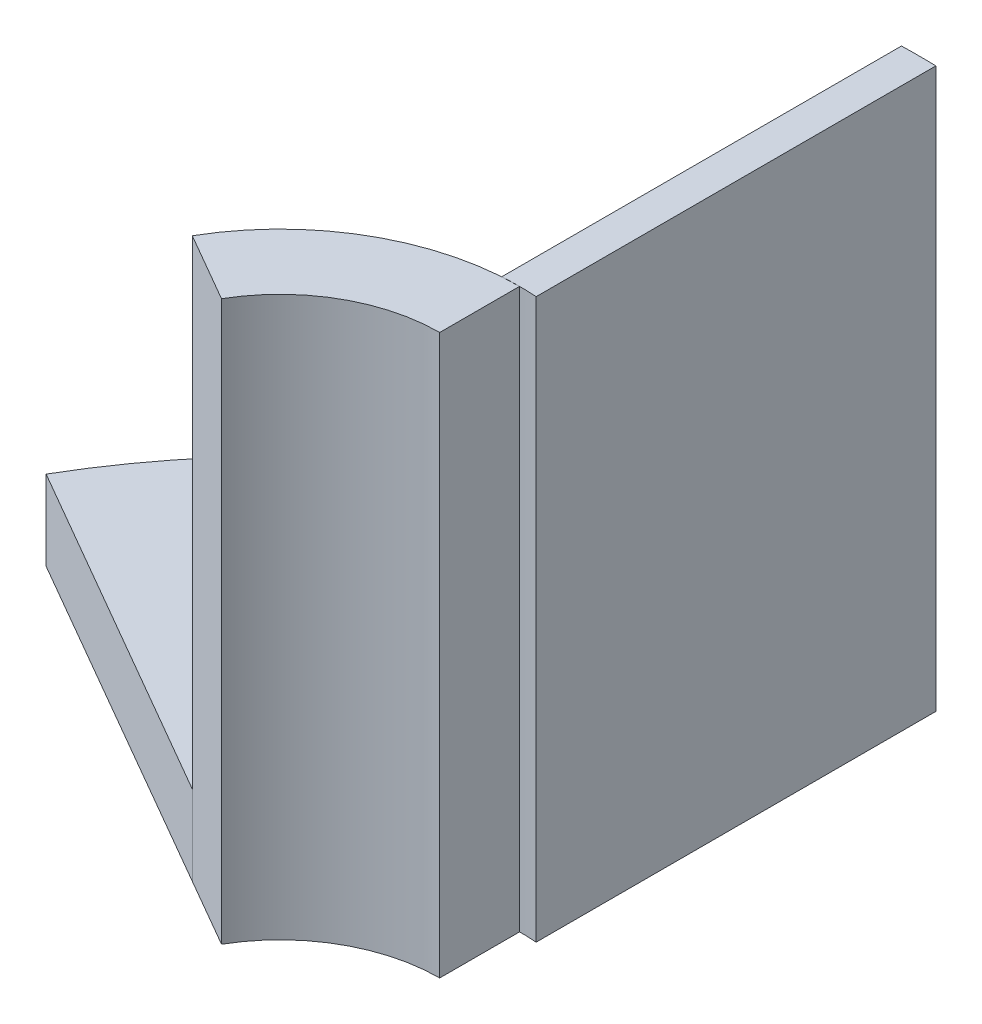
ISO-10303-21;
HEADER;
FILE_DESCRIPTION(('STEP AP214'),'2;1');
FILE_NAME('part.step','',(''),(''),'','','');
FILE_SCHEMA(('AUTOMOTIVE_DESIGN { 1 0 10303 214 1 1 1 1 }'));
ENDSEC;
DATA;
#1=APPLICATION_CONTEXT('core data for automotive mechanical design processes');
#2=APPLICATION_PROTOCOL_DEFINITION('international standard','automotive_design',2000,#1);
#3=PRODUCT_CONTEXT('',#1,'mechanical');
#4=PRODUCT('Part','Part','',(#3));
#5=PRODUCT_RELATED_PRODUCT_CATEGORY('part','',(#4));
#6=PRODUCT_DEFINITION_FORMATION('','',#4);
#7=PRODUCT_DEFINITION_CONTEXT('part definition',#1,'design');
#8=PRODUCT_DEFINITION('design','',#6,#7);
#9=PRODUCT_DEFINITION_SHAPE('','',#8);
#10=(LENGTH_UNIT() NAMED_UNIT(*) SI_UNIT(.MILLI.,.METRE.));
#11=(NAMED_UNIT(*) PLANE_ANGLE_UNIT() SI_UNIT($,.RADIAN.));
#12=(NAMED_UNIT(*) SI_UNIT($,.STERADIAN.) SOLID_ANGLE_UNIT());
#13=UNCERTAINTY_MEASURE_WITH_UNIT(LENGTH_MEASURE(1.E-05),#10,'distance_accuracy_value','');
#14=(GEOMETRIC_REPRESENTATION_CONTEXT(3) GLOBAL_UNCERTAINTY_ASSIGNED_CONTEXT((#13)) GLOBAL_UNIT_ASSIGNED_CONTEXT((#10,
#11,#12)) REPRESENTATION_CONTEXT('',''));
#15=CARTESIAN_POINT('',(0.,0.,0.));
#16=DIRECTION('',(0.,0.,1.));
#17=DIRECTION('',(1.,0.,0.));
#18=AXIS2_PLACEMENT_3D('',#15,#16,#17);
#19=CARTESIAN_POINT('',(0.,35.,0.));
#20=DIRECTION('',(0.,1.,0.));
#21=DIRECTION('',(0.,0.,1.));
#22=AXIS2_PLACEMENT_3D('',#19,#20,#21);
#23=PLANE('',#22);
#24=DIRECTION('',(0.,0.,1.));
#25=VECTOR('',#24,1.);
#26=CARTESIAN_POINT('',(1.07783990665666,35.,291558.));
#27=LINE('',#26,#25);
#28=CARTESIAN_POINT('',(1.07783990658591,35.,-39.9854756272475));
#29=VERTEX_POINT('',#28);
#30=CARTESIAN_POINT('',(1.07783990658592,35.,-14.9612252551492));
#31=VERTEX_POINT('',#30);
#32=EDGE_CURVE('E98',#29,#31,#27,.T.);
#33=ORIENTED_EDGE('',*,*,#32,.F.);
#34=CARTESIAN_POINT('',(0.,35.,0.));
#35=DIRECTION('',(0.,1.,0.));
#36=DIRECTION('',(0.,0.,1.));
#37=AXIS2_PLACEMENT_3D('',#34,#35,#36);
#38=CIRCLE('',#37,40.);
#39=CARTESIAN_POINT('',(-1.07783990659982,35.,-39.9854756272475));
#40=VERTEX_POINT('',#39);
#41=EDGE_CURVE('E116',#29,#40,#38,.T.);
#42=ORIENTED_EDGE('',*,*,#41,.T.);
#43=DIRECTION('',(0.,0.,-1.));
#44=VECTOR('',#43,1.);
#45=CARTESIAN_POINT('',(-1.07783990659982,35.,291558.));
#46=LINE('',#45,#44);
#47=CARTESIAN_POINT('',(-1.07783990659986,35.,-14.9612252551498));
#48=VERTEX_POINT('',#47);
#49=EDGE_CURVE('E91',#48,#40,#46,.T.);
#50=ORIENTED_EDGE('',*,*,#49,.F.);
#51=CARTESIAN_POINT('',(0.,35.,0.));
#52=DIRECTION('',(0.,1.,0.));
#53=DIRECTION('',(0.,0.,1.));
#54=AXIS2_PLACEMENT_3D('',#51,#52,#53);
#55=CIRCLE('',#54,14.9999999999864);
#56=EDGE_CURVE('E95',#31,#48,#55,.T.);
#57=ORIENTED_EDGE('',*,*,#56,.F.);
#58=EDGE_LOOP('',(#33,#42,#50,#57));
#59=FACE_BOUND('',#58,.T.);
#60=ADVANCED_FACE('F56',(#59),#23,.T.);
#61=CARTESIAN_POINT('',(0.,0.,0.));
#62=DIRECTION('',(0.,1.,0.));
#63=DIRECTION('',(0.,0.,1.));
#64=AXIS2_PLACEMENT_3D('',#61,#62,#63);
#65=PLANE('',#64);
#66=CARTESIAN_POINT('',(0.,0.,0.));
#67=DIRECTION('',(0.,1.,0.));
#68=DIRECTION('',(0.,0.,1.));
#69=AXIS2_PLACEMENT_3D('',#66,#67,#68);
#70=CIRCLE('',#69,40.);
#71=CARTESIAN_POINT('',(1.07783990658591,0.,-39.9854756272475));
#72=VERTEX_POINT('',#71);
#73=CARTESIAN_POINT('',(-1.07783990659982,0.,-39.9854756272475));
#74=VERTEX_POINT('',#73);
#75=EDGE_CURVE('E12',#72,#74,#70,.T.);
#76=ORIENTED_EDGE('',*,*,#75,.F.);
#77=DIRECTION('',(0.,0.,1.));
#78=VECTOR('',#77,1.);
#79=CARTESIAN_POINT('',(1.07783990665666,0.,291558.));
#80=LINE('',#79,#78);
#81=CARTESIAN_POINT('',(1.07783990658592,0.,-14.9612252551492));
#82=VERTEX_POINT('',#81);
#83=EDGE_CURVE('E118',#72,#82,#80,.T.);
#84=ORIENTED_EDGE('',*,*,#83,.T.);
#85=CARTESIAN_POINT('',(0.,0.,0.));
#86=DIRECTION('',(0.,1.,0.));
#87=DIRECTION('',(0.,0.,1.));
#88=AXIS2_PLACEMENT_3D('',#85,#86,#87);
#89=CIRCLE('',#88,14.9999999999864);
#90=CARTESIAN_POINT('',(-1.07783990659986,0.,-14.9612252551498));
#91=VERTEX_POINT('',#90);
#92=EDGE_CURVE('E106',#82,#91,#89,.T.);
#93=ORIENTED_EDGE('',*,*,#92,.T.);
#94=DIRECTION('',(0.,0.,-1.));
#95=VECTOR('',#94,1.);
#96=CARTESIAN_POINT('',(-1.07783990659982,0.,291558.));
#97=LINE('',#96,#95);
#98=EDGE_CURVE('E111',#91,#74,#97,.T.);
#99=ORIENTED_EDGE('',*,*,#98,.T.);
#100=EDGE_LOOP('',(#76,#84,#93,#99));
#101=FACE_BOUND('',#100,.T.);
#102=ADVANCED_FACE('F127',(#101),#65,.F.);
#103=CARTESIAN_POINT('',(1.07783990665666,60.1313986117039,291558.));
#104=DIRECTION('',(1.,0.,0.));
#105=DIRECTION('',(0.,0.,-1.));
#106=AXIS2_PLACEMENT_3D('',#103,#104,#105);
#107=PLANE('',#106);
#108=DIRECTION('',(0.,-1.,0.));
#109=VECTOR('',#108,1.);
#110=CARTESIAN_POINT('',(1.07783990658591,60.1313986117039,-39.9854756272475));
#111=LINE('',#110,#109);
#112=EDGE_CURVE('E59',#29,#72,#111,.T.);
#113=ORIENTED_EDGE('',*,*,#112,.F.);
#114=ORIENTED_EDGE('',*,*,#32,.T.);
#115=DIRECTION('',(0.,-1.,0.));
#116=VECTOR('',#115,1.);
#117=CARTESIAN_POINT('',(1.07783990658592,60.1313986117039,-14.9612252551492));
#118=LINE('',#117,#116);
#119=EDGE_CURVE('E101',#31,#82,#118,.T.);
#120=ORIENTED_EDGE('',*,*,#119,.T.);
#121=ORIENTED_EDGE('',*,*,#83,.F.);
#122=EDGE_LOOP('',(#113,#114,#120,#121));
#123=FACE_BOUND('',#122,.T.);
#124=ADVANCED_FACE('F110',(#123),#107,.T.);
#125=CARTESIAN_POINT('',(0.,60.1313986117039,0.));
#126=DIRECTION('',(0.,-1.,0.));
#127=DIRECTION('',(0.,0.,-1.));
#128=AXIS2_PLACEMENT_3D('',#125,#126,#127);
#129=CYLINDRICAL_SURFACE('',#128,14.9999999999864);
#130=ORIENTED_EDGE('',*,*,#119,.F.);
#131=ORIENTED_EDGE('',*,*,#56,.T.);
#132=DIRECTION('',(0.,-1.,0.));
#133=VECTOR('',#132,1.);
#134=CARTESIAN_POINT('',(-1.07783990659986,60.1313986117039,-14.9612252551498));
#135=LINE('',#134,#133);
#136=EDGE_CURVE('E100',#48,#91,#135,.T.);
#137=ORIENTED_EDGE('',*,*,#136,.T.);
#138=ORIENTED_EDGE('',*,*,#92,.F.);
#139=EDGE_LOOP('',(#130,#131,#137,#138));
#140=FACE_BOUND('',#139,.T.);
#141=ADVANCED_FACE('F104',(#140),#129,.F.);
#142=CARTESIAN_POINT('',(-1.07783990659982,60.1313986117039,291558.));
#143=DIRECTION('',(-1.,0.,0.));
#144=DIRECTION('',(0.,0.,1.));
#145=AXIS2_PLACEMENT_3D('',#142,#143,#144);
#146=PLANE('',#145);
#147=ORIENTED_EDGE('',*,*,#136,.F.);
#148=ORIENTED_EDGE('',*,*,#49,.T.);
#149=DIRECTION('',(0.,-1.,0.));
#150=VECTOR('',#149,1.);
#151=CARTESIAN_POINT('',(-1.07783990659982,60.1313986117039,-39.9854756272475));
#152=LINE('',#151,#150);
#153=EDGE_CURVE('E119',#40,#74,#152,.T.);
#154=ORIENTED_EDGE('',*,*,#153,.T.);
#155=ORIENTED_EDGE('',*,*,#98,.F.);
#156=EDGE_LOOP('',(#147,#148,#154,#155));
#157=FACE_BOUND('',#156,.T.);
#158=ADVANCED_FACE('F124',(#157),#146,.T.);
#159=CARTESIAN_POINT('',(0.,60.1313986117039,0.));
#160=DIRECTION('',(0.,-1.,0.));
#161=DIRECTION('',(0.,0.,-1.));
#162=AXIS2_PLACEMENT_3D('',#159,#160,#161);
#163=CYLINDRICAL_SURFACE('',#162,40.);
#164=ORIENTED_EDGE('',*,*,#41,.F.);
#165=ORIENTED_EDGE('',*,*,#112,.T.);
#166=ORIENTED_EDGE('',*,*,#75,.T.);
#167=ORIENTED_EDGE('',*,*,#153,.F.);
#168=EDGE_LOOP('',(#164,#165,#166,#167));
#169=FACE_BOUND('',#168,.T.);
#170=ADVANCED_FACE('F130',(#169),#163,.T.);
#171=CLOSED_SHELL('',(#60,#102,#124,#141,#158,#170));
#172=MANIFOLD_SOLID_BREP('B2',#171);
#173=CARTESIAN_POINT('',(-173764.510663002,51.393596310753,-100322.987006888));
#174=DIRECTION('',(-0.5,0.,0.866025403784439));
#175=DIRECTION('',(0.866025403784439,0.,0.5));
#176=AXIS2_PLACEMENT_3D('',#173,#174,#175);
#177=PLANE('',#176);
#178=DIRECTION('',(0.,-1.,0.));
#179=VECTOR('',#178,1.);
#180=CARTESIAN_POINT('',(-8.6602540378729,51.393596310753,-4.99999999995061));
#181=LINE('',#180,#179);
#182=CARTESIAN_POINT('',(-8.6602540378729,35.,-4.99999999995061));
#183=VERTEX_POINT('',#182);
#184=CARTESIAN_POINT('',(-8.6602540378729,0.,-4.99999999995061));
#185=VERTEX_POINT('',#184);
#186=EDGE_CURVE('E246',#183,#185,#181,.T.);
#187=ORIENTED_EDGE('',*,*,#186,.F.);
#188=DIRECTION('',(-0.866025403784439,0.,-0.5));
#189=VECTOR('',#188,1.);
#190=CARTESIAN_POINT('',(-173764.510663002,35.,-100322.987006888));
#191=LINE('',#190,#189);
#192=CARTESIAN_POINT('',(-12.9903810567597,35.,-7.49999999992458));
#193=VERTEX_POINT('',#192);
#194=EDGE_CURVE('E255',#183,#193,#191,.T.);
#195=ORIENTED_EDGE('',*,*,#194,.T.);
#196=DIRECTION('',(0.,-1.,0.));
#197=VECTOR('',#196,1.);
#198=CARTESIAN_POINT('',(-12.9903810567597,51.393596310753,-7.49999999992458));
#199=LINE('',#198,#197);
#200=CARTESIAN_POINT('',(-12.9903810567597,0.,-7.49999999992458));
#201=VERTEX_POINT('',#200);
#202=EDGE_CURVE('E193',#193,#201,#199,.T.);
#203=ORIENTED_EDGE('',*,*,#202,.T.);
#204=DIRECTION('',(-0.866025403784439,0.,-0.5));
#205=VECTOR('',#204,1.);
#206=CARTESIAN_POINT('',(-173764.510663002,0.,-100322.987006888));
#207=LINE('',#206,#205);
#208=EDGE_CURVE('E252',#185,#201,#207,.T.);
#209=ORIENTED_EDGE('',*,*,#208,.F.);
#210=EDGE_LOOP('',(#187,#195,#203,#209));
#211=FACE_BOUND('',#210,.T.);
#212=ADVANCED_FACE('F189',(#211),#177,.T.);
#213=CARTESIAN_POINT('',(0.,51.393596310753,0.));
#214=DIRECTION('',(0.,-1.,0.));
#215=DIRECTION('',(0.,0.,-1.));
#216=AXIS2_PLACEMENT_3D('',#213,#214,#215);
#217=CYLINDRICAL_SURFACE('',#216,10.);
#218=DIRECTION('',(0.,-1.,0.));
#219=VECTOR('',#218,1.);
#220=CARTESIAN_POINT('',(0.,51.393596310753,-10.));
#221=LINE('',#220,#219);
#222=CARTESIAN_POINT('',(0.,35.,-10.));
#223=VERTEX_POINT('',#222);
#224=CARTESIAN_POINT('',(0.,0.,-10.));
#225=VERTEX_POINT('',#224);
#226=EDGE_CURVE('E242',#223,#225,#221,.T.);
#227=ORIENTED_EDGE('',*,*,#226,.F.);
#228=CARTESIAN_POINT('',(0.,35.,0.));
#229=DIRECTION('',(0.,1.,0.));
#230=DIRECTION('',(0.,0.,1.));
#231=AXIS2_PLACEMENT_3D('',#228,#229,#230);
#232=CIRCLE('',#231,10.);
#233=EDGE_CURVE('E228',#223,#183,#232,.T.);
#234=ORIENTED_EDGE('',*,*,#233,.T.);
#235=ORIENTED_EDGE('',*,*,#186,.T.);
#236=CARTESIAN_POINT('',(0.,0.,0.));
#237=DIRECTION('',(0.,1.,0.));
#238=DIRECTION('',(0.,0.,1.));
#239=AXIS2_PLACEMENT_3D('',#236,#237,#238);
#240=CIRCLE('',#239,10.);
#241=EDGE_CURVE('E198',#225,#185,#240,.T.);
#242=ORIENTED_EDGE('',*,*,#241,.F.);
#243=EDGE_LOOP('',(#227,#234,#235,#242));
#244=FACE_BOUND('',#243,.T.);
#245=ADVANCED_FACE('F259',(#244),#217,.F.);
#246=CARTESIAN_POINT('',(0.,51.393596310753,291558.375));
#247=DIRECTION('',(1.,0.,0.));
#248=DIRECTION('',(0.,0.,-1.));
#249=AXIS2_PLACEMENT_3D('',#246,#247,#248);
#250=PLANE('',#249);
#251=DIRECTION('',(0.,-1.,0.));
#252=VECTOR('',#251,1.);
#253=CARTESIAN_POINT('',(0.,51.393596310753,-14.9999999999295));
#254=LINE('',#253,#252);
#255=CARTESIAN_POINT('',(0.,35.,-14.9999999999295));
#256=VERTEX_POINT('',#255);
#257=CARTESIAN_POINT('',(0.,0.,-14.9999999999295));
#258=VERTEX_POINT('',#257);
#259=EDGE_CURVE('E211',#256,#258,#254,.T.);
#260=ORIENTED_EDGE('',*,*,#259,.F.);
#261=DIRECTION('',(0.,0.,1.));
#262=VECTOR('',#261,1.);
#263=CARTESIAN_POINT('',(0.,35.,291558.375));
#264=LINE('',#263,#262);
#265=EDGE_CURVE('E236',#256,#223,#264,.T.);
#266=ORIENTED_EDGE('',*,*,#265,.T.);
#267=ORIENTED_EDGE('',*,*,#226,.T.);
#268=DIRECTION('',(0.,0.,1.));
#269=VECTOR('',#268,1.);
#270=CARTESIAN_POINT('',(0.,0.,291558.375));
#271=LINE('',#270,#269);
#272=EDGE_CURVE('E240',#258,#225,#271,.T.);
#273=ORIENTED_EDGE('',*,*,#272,.F.);
#274=EDGE_LOOP('',(#260,#266,#267,#273));
#275=FACE_BOUND('',#274,.T.);
#276=ADVANCED_FACE('F238',(#275),#250,.T.);
#277=CARTESIAN_POINT('',(0.,51.393596310753,0.));
#278=DIRECTION('',(0.,-1.,0.));
#279=DIRECTION('',(0.,0.,-1.));
#280=AXIS2_PLACEMENT_3D('',#277,#278,#279);
#281=CYLINDRICAL_SURFACE('',#280,14.9999999999563);
#282=CARTESIAN_POINT('',(0.,35.,0.));
#283=DIRECTION('',(0.,1.,0.));
#284=DIRECTION('',(0.,0.,1.));
#285=AXIS2_PLACEMENT_3D('',#282,#283,#284);
#286=CIRCLE('',#285,14.9999999999563);
#287=EDGE_CURVE('E54',#256,#193,#286,.T.);
#288=ORIENTED_EDGE('',*,*,#287,.F.);
#289=ORIENTED_EDGE('',*,*,#259,.T.);
#290=CARTESIAN_POINT('',(0.,0.,0.));
#291=DIRECTION('',(0.,1.,0.));
#292=DIRECTION('',(0.,0.,1.));
#293=AXIS2_PLACEMENT_3D('',#290,#291,#292);
#294=CIRCLE('',#293,14.9999999999563);
#295=EDGE_CURVE('E241',#258,#201,#294,.T.);
#296=ORIENTED_EDGE('',*,*,#295,.T.);
#297=ORIENTED_EDGE('',*,*,#202,.F.);
#298=EDGE_LOOP('',(#288,#289,#296,#297));
#299=FACE_BOUND('',#298,.T.);
#300=ADVANCED_FACE('F243',(#299),#281,.T.);
#301=CARTESIAN_POINT('',(0.,0.,0.));
#302=DIRECTION('',(0.,1.,0.));
#303=DIRECTION('',(0.,0.,1.));
#304=AXIS2_PLACEMENT_3D('',#301,#302,#303);
#305=PLANE('',#304);
#306=ORIENTED_EDGE('',*,*,#208,.T.);
#307=ORIENTED_EDGE('',*,*,#295,.F.);
#308=ORIENTED_EDGE('',*,*,#272,.T.);
#309=ORIENTED_EDGE('',*,*,#241,.T.);
#310=EDGE_LOOP('',(#306,#307,#308,#309));
#311=FACE_BOUND('',#310,.T.);
#312=ADVANCED_FACE('F263',(#311),#305,.F.);
#313=CARTESIAN_POINT('',(0.,35.,0.));
#314=DIRECTION('',(0.,1.,0.));
#315=DIRECTION('',(0.,0.,1.));
#316=AXIS2_PLACEMENT_3D('',#313,#314,#315);
#317=PLANE('',#316);
#318=ORIENTED_EDGE('',*,*,#194,.F.);
#319=ORIENTED_EDGE('',*,*,#233,.F.);
#320=ORIENTED_EDGE('',*,*,#265,.F.);
#321=ORIENTED_EDGE('',*,*,#287,.T.);
#322=EDGE_LOOP('',(#318,#319,#320,#321));
#323=FACE_BOUND('',#322,.T.);
#324=ADVANCED_FACE('F191',(#323),#317,.T.);
#325=CLOSED_SHELL('',(#212,#245,#276,#300,#312,#324));
#326=MANIFOLD_SOLID_BREP('B6',#325);
#327=CARTESIAN_POINT('',(0.,5.,0.));
#328=DIRECTION('',(0.,1.,0.));
#329=DIRECTION('',(0.,0.,1.));
#330=AXIS2_PLACEMENT_3D('',#327,#328,#329);
#331=PLANE('',#330);
#332=CARTESIAN_POINT('',(0.,5.,0.));
#333=DIRECTION('',(0.,1.,0.));
#334=DIRECTION('',(0.,0.,1.));
#335=AXIS2_PLACEMENT_3D('',#332,#333,#334);
#336=CIRCLE('',#335,15.);
#337=CARTESIAN_POINT('',(0.,5.,-14.9999999999864));
#338=VERTEX_POINT('',#337);
#339=CARTESIAN_POINT('',(-12.99038105671,5.,-7.49999999995055));
#340=VERTEX_POINT('',#339);
#341=EDGE_CURVE('E322',#338,#340,#336,.T.);
#342=ORIENTED_EDGE('',*,*,#341,.F.);
#343=DIRECTION('',(0.,0.,1.));
#344=VECTOR('',#343,1.);
#345=CARTESIAN_POINT('',(0.,5.,291558.375));
#346=LINE('',#345,#344);
#347=CARTESIAN_POINT('',(0.,5.,-40.));
#348=VERTEX_POINT('',#347);
#349=EDGE_CURVE('E345',#348,#338,#346,.T.);
#350=ORIENTED_EDGE('',*,*,#349,.F.);
#351=CARTESIAN_POINT('',(0.,5.,0.));
#352=DIRECTION('',(0.,1.,0.));
#353=DIRECTION('',(0.,0.,1.));
#354=AXIS2_PLACEMENT_3D('',#351,#352,#353);
#355=CIRCLE('',#354,40.);
#356=CARTESIAN_POINT('',(-34.6410161513884,5.,-19.9999999999811));
#357=VERTEX_POINT('',#356);
#358=EDGE_CURVE('E350',#348,#357,#355,.T.);
#359=ORIENTED_EDGE('',*,*,#358,.T.);
#360=DIRECTION('',(-0.866025403784439,0.,-0.5));
#361=VECTOR('',#360,1.);
#362=CARTESIAN_POINT('',(-173764.510663002,5.,-100322.987006888));
#363=LINE('',#362,#361);
#364=EDGE_CURVE('E365',#340,#357,#363,.T.);
#365=ORIENTED_EDGE('',*,*,#364,.F.);
#366=EDGE_LOOP('',(#342,#350,#359,#365));
#367=FACE_BOUND('',#366,.T.);
#368=ADVANCED_FACE('F313',(#367),#331,.T.);
#369=CARTESIAN_POINT('',(0.,0.,0.));
#370=DIRECTION('',(0.,1.,0.));
#371=DIRECTION('',(0.,0.,1.));
#372=AXIS2_PLACEMENT_3D('',#369,#370,#371);
#373=PLANE('',#372);
#374=CARTESIAN_POINT('',(0.,0.,0.));
#375=DIRECTION('',(0.,1.,0.));
#376=DIRECTION('',(0.,0.,1.));
#377=AXIS2_PLACEMENT_3D('',#374,#375,#376);
#378=CIRCLE('',#377,15.);
#379=CARTESIAN_POINT('',(0.,0.,-14.9999999999864));
#380=VERTEX_POINT('',#379);
#381=CARTESIAN_POINT('',(-12.99038105671,0.,-7.49999999995055));
#382=VERTEX_POINT('',#381);
#383=EDGE_CURVE('E375',#380,#382,#378,.T.);
#384=ORIENTED_EDGE('',*,*,#383,.T.);
#385=DIRECTION('',(-0.866025403784439,0.,-0.5));
#386=VECTOR('',#385,1.);
#387=CARTESIAN_POINT('',(-173764.510663002,0.,-100322.987006888));
#388=LINE('',#387,#386);
#389=CARTESIAN_POINT('',(-34.6410161513884,0.,-19.9999999999811));
#390=VERTEX_POINT('',#389);
#391=EDGE_CURVE('E363',#382,#390,#388,.T.);
#392=ORIENTED_EDGE('',*,*,#391,.T.);
#393=CARTESIAN_POINT('',(0.,0.,0.));
#394=DIRECTION('',(0.,1.,0.));
#395=DIRECTION('',(0.,0.,1.));
#396=AXIS2_PLACEMENT_3D('',#393,#394,#395);
#397=CIRCLE('',#396,40.);
#398=CARTESIAN_POINT('',(0.,0.,-40.0000000000205));
#399=VERTEX_POINT('',#398);
#400=EDGE_CURVE('E367',#399,#390,#397,.T.);
#401=ORIENTED_EDGE('',*,*,#400,.F.);
#402=DIRECTION('',(0.,0.,1.));
#403=VECTOR('',#402,1.);
#404=CARTESIAN_POINT('',(0.,0.,291558.375));
#405=LINE('',#404,#403);
#406=EDGE_CURVE('E377',#399,#380,#405,.T.);
#407=ORIENTED_EDGE('',*,*,#406,.T.);
#408=EDGE_LOOP('',(#384,#392,#401,#407));
#409=FACE_BOUND('',#408,.T.);
#410=ADVANCED_FACE('F374',(#409),#373,.F.);
#411=CARTESIAN_POINT('',(-173764.510663002,52.5000000000558,-100322.987006888));
#412=DIRECTION('',(-0.5,0.,0.866025403784439));
#413=DIRECTION('',(0.866025403784439,0.,0.5));
#414=AXIS2_PLACEMENT_3D('',#411,#412,#413);
#415=PLANE('',#414);
#416=DIRECTION('',(0.,-1.,0.));
#417=VECTOR('',#416,1.);
#418=CARTESIAN_POINT('',(-12.99038105671,52.5000000000558,-7.49999999995055));
#419=LINE('',#418,#417);
#420=EDGE_CURVE('E187',#340,#382,#419,.T.);
#421=ORIENTED_EDGE('',*,*,#420,.F.);
#422=ORIENTED_EDGE('',*,*,#364,.T.);
#423=DIRECTION('',(0.,-1.,0.));
#424=VECTOR('',#423,1.);
#425=CARTESIAN_POINT('',(-34.6410161513884,52.5000000000558,-19.9999999999811));
#426=LINE('',#425,#424);
#427=EDGE_CURVE('E360',#357,#390,#426,.T.);
#428=ORIENTED_EDGE('',*,*,#427,.T.);
#429=ORIENTED_EDGE('',*,*,#391,.F.);
#430=EDGE_LOOP('',(#421,#422,#428,#429));
#431=FACE_BOUND('',#430,.T.);
#432=ADVANCED_FACE('F361',(#431),#415,.T.);
#433=CARTESIAN_POINT('',(0.,52.5000000000558,0.));
#434=DIRECTION('',(0.,-1.,0.));
#435=DIRECTION('',(0.,0.,-1.));
#436=AXIS2_PLACEMENT_3D('',#433,#434,#435);
#437=CYLINDRICAL_SURFACE('',#436,40.);
#438=ORIENTED_EDGE('',*,*,#358,.F.);
#439=DIRECTION('',(0.,-1.,0.));
#440=VECTOR('',#439,1.);
#441=CARTESIAN_POINT('',(0.,52.5000000000558,-40.0000000000205));
#442=LINE('',#441,#440);
#443=EDGE_CURVE('E355',#348,#399,#442,.T.);
#444=ORIENTED_EDGE('',*,*,#443,.T.);
#445=ORIENTED_EDGE('',*,*,#400,.T.);
#446=ORIENTED_EDGE('',*,*,#427,.F.);
#447=EDGE_LOOP('',(#438,#444,#445,#446));
#448=FACE_BOUND('',#447,.T.);
#449=ADVANCED_FACE('F368',(#448),#437,.T.);
#450=CARTESIAN_POINT('',(0.,52.5000000000558,291558.375));
#451=DIRECTION('',(1.,0.,0.));
#452=DIRECTION('',(0.,0.,-1.));
#453=AXIS2_PLACEMENT_3D('',#450,#451,#452);
#454=PLANE('',#453);
#455=ORIENTED_EDGE('',*,*,#443,.F.);
#456=ORIENTED_EDGE('',*,*,#349,.T.);
#457=DIRECTION('',(0.,-1.,0.));
#458=VECTOR('',#457,1.);
#459=CARTESIAN_POINT('',(0.,52.5000000000558,-14.9999999999864));
#460=LINE('',#459,#458);
#461=EDGE_CURVE('E388',#338,#380,#460,.T.);
#462=ORIENTED_EDGE('',*,*,#461,.T.);
#463=ORIENTED_EDGE('',*,*,#406,.F.);
#464=EDGE_LOOP('',(#455,#456,#462,#463));
#465=FACE_BOUND('',#464,.T.);
#466=ADVANCED_FACE('F398',(#465),#454,.T.);
#467=CARTESIAN_POINT('',(0.,52.5000000000558,0.));
#468=DIRECTION('',(0.,-1.,0.));
#469=DIRECTION('',(0.,0.,-1.));
#470=AXIS2_PLACEMENT_3D('',#467,#468,#469);
#471=CYLINDRICAL_SURFACE('',#470,15.);
#472=ORIENTED_EDGE('',*,*,#461,.F.);
#473=ORIENTED_EDGE('',*,*,#341,.T.);
#474=ORIENTED_EDGE('',*,*,#420,.T.);
#475=ORIENTED_EDGE('',*,*,#383,.F.);
#476=EDGE_LOOP('',(#472,#473,#474,#475));
#477=FACE_BOUND('',#476,.T.);
#478=ADVANCED_FACE('F399',(#477),#471,.F.);
#479=CLOSED_SHELL('',(#368,#410,#432,#449,#466,#478));
#480=MANIFOLD_SOLID_BREP('B48',#479);
#481=ADVANCED_BREP_SHAPE_REPRESENTATION('',(#18,#172,#326,#480),#14);
#482=SHAPE_DEFINITION_REPRESENTATION(#9,#481);
ENDSEC;
END-ISO-10303-21;
